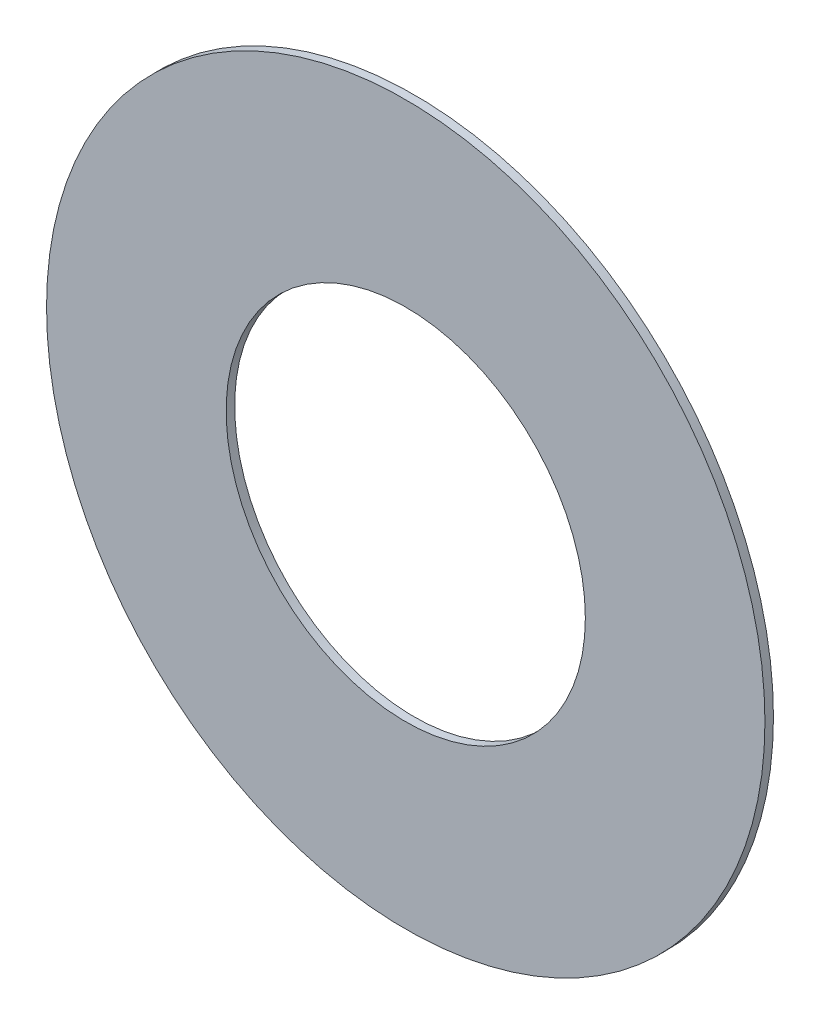
ISO-10303-21;
HEADER;
FILE_DESCRIPTION(('STEP AP214'),'2;1');
FILE_NAME('part.step','',(''),(''),'','','');
FILE_SCHEMA(('AUTOMOTIVE_DESIGN { 1 0 10303 214 1 1 1 1 }'));
ENDSEC;
DATA;
#1=APPLICATION_CONTEXT('core data for automotive mechanical design processes');
#2=APPLICATION_PROTOCOL_DEFINITION('international standard','automotive_design',2000,#1);
#3=PRODUCT_CONTEXT('',#1,'mechanical');
#4=PRODUCT('Part','Part','',(#3));
#5=PRODUCT_RELATED_PRODUCT_CATEGORY('part','',(#4));
#6=PRODUCT_DEFINITION_FORMATION('','',#4);
#7=PRODUCT_DEFINITION_CONTEXT('part definition',#1,'design');
#8=PRODUCT_DEFINITION('design','',#6,#7);
#9=PRODUCT_DEFINITION_SHAPE('','',#8);
#10=(LENGTH_UNIT() NAMED_UNIT(*) SI_UNIT(.MILLI.,.METRE.));
#11=(NAMED_UNIT(*) PLANE_ANGLE_UNIT() SI_UNIT($,.RADIAN.));
#12=(NAMED_UNIT(*) SI_UNIT($,.STERADIAN.) SOLID_ANGLE_UNIT());
#13=UNCERTAINTY_MEASURE_WITH_UNIT(LENGTH_MEASURE(1.E-05),#10,'distance_accuracy_value','');
#14=(GEOMETRIC_REPRESENTATION_CONTEXT(3) GLOBAL_UNCERTAINTY_ASSIGNED_CONTEXT((#13)) GLOBAL_UNIT_ASSIGNED_CONTEXT((#10,
#11,#12)) REPRESENTATION_CONTEXT('',''));
#15=CARTESIAN_POINT('',(0.,0.,0.));
#16=DIRECTION('',(0.,0.,1.));
#17=DIRECTION('',(1.,0.,0.));
#18=AXIS2_PLACEMENT_3D('',#15,#16,#17);
#19=CARTESIAN_POINT('',(0.,0.,0.));
#20=DIRECTION('',(0.,0.,-1.));
#21=DIRECTION('',(1.,0.,0.));
#22=AXIS2_PLACEMENT_3D('',#19,#20,#21);
#23=CYLINDRICAL_SURFACE('',#22,1.49999954);
#24=CARTESIAN_POINT('',(0.,0.,0.03556));
#25=DIRECTION('',(0.,0.,1.));
#26=DIRECTION('',(1.,0.,0.));
#27=AXIS2_PLACEMENT_3D('',#24,#25,#26);
#28=CIRCLE('',#27,1.49999954);
#29=CARTESIAN_POINT('',(1.49999954,0.,0.03556));
#30=VERTEX_POINT('',#29);
#31=EDGE_CURVE('E11',#30,#30,#28,.T.);
#32=ORIENTED_EDGE('',*,*,#31,.F.);
#33=DIRECTION('',(0.,0.,1.));
#34=VECTOR('',#33,1.);
#35=CARTESIAN_POINT('',(1.49999954,0.,0.));
#36=LINE('',#35,#34);
#37=CARTESIAN_POINT('',(1.49999954,0.,0.));
#38=VERTEX_POINT('',#37);
#39=EDGE_CURVE('E24',#38,#30,#36,.T.);
#40=ORIENTED_EDGE('',*,*,#39,.F.);
#41=CARTESIAN_POINT('',(0.,0.,0.));
#42=DIRECTION('',(0.,0.,1.));
#43=DIRECTION('',(1.,0.,0.));
#44=AXIS2_PLACEMENT_3D('',#41,#42,#43);
#45=CIRCLE('',#44,1.49999954);
#46=EDGE_CURVE('E46',#38,#38,#45,.T.);
#47=ORIENTED_EDGE('',*,*,#46,.T.);
#48=ORIENTED_EDGE('',*,*,#39,.T.);
#49=EDGE_LOOP('',(#32,#40,#47,#48));
#50=FACE_BOUND('',#49,.T.);
#51=ADVANCED_FACE('F17',(#50),#23,.T.);
#52=CARTESIAN_POINT('',(0.,0.,0.));
#53=DIRECTION('',(0.,0.,-1.));
#54=DIRECTION('',(1.,0.,0.));
#55=AXIS2_PLACEMENT_3D('',#52,#53,#54);
#56=CYLINDRICAL_SURFACE('',#55,0.7499985);
#57=DIRECTION('',(0.,0.,1.));
#58=VECTOR('',#57,1.);
#59=CARTESIAN_POINT('',(0.7499985,0.,0.));
#60=LINE('',#59,#58);
#61=CARTESIAN_POINT('',(0.7499985,0.,0.));
#62=VERTEX_POINT('',#61);
#63=CARTESIAN_POINT('',(0.7499985,0.,0.03556));
#64=VERTEX_POINT('',#63);
#65=EDGE_CURVE('E40',#62,#64,#60,.T.);
#66=ORIENTED_EDGE('',*,*,#65,.T.);
#67=CARTESIAN_POINT('',(0.,0.,0.03556));
#68=DIRECTION('',(0.,0.,1.));
#69=DIRECTION('',(1.,0.,0.));
#70=AXIS2_PLACEMENT_3D('',#67,#68,#69);
#71=CIRCLE('',#70,0.7499985);
#72=EDGE_CURVE('E45',#64,#64,#71,.T.);
#73=ORIENTED_EDGE('',*,*,#72,.T.);
#74=ORIENTED_EDGE('',*,*,#65,.F.);
#75=CARTESIAN_POINT('',(0.,0.,0.));
#76=DIRECTION('',(0.,0.,1.));
#77=DIRECTION('',(1.,0.,0.));
#78=AXIS2_PLACEMENT_3D('',#75,#76,#77);
#79=CIRCLE('',#78,0.7499985);
#80=EDGE_CURVE('E43',#62,#62,#79,.T.);
#81=ORIENTED_EDGE('',*,*,#80,.F.);
#82=EDGE_LOOP('',(#66,#73,#74,#81));
#83=FACE_BOUND('',#82,.T.);
#84=ADVANCED_FACE('F42',(#83),#56,.F.);
#85=CARTESIAN_POINT('',(1.49999954,0.,0.));
#86=DIRECTION('',(0.,0.,-1.));
#87=DIRECTION('',(-1.,0.,0.));
#88=AXIS2_PLACEMENT_3D('',#85,#86,#87);
#89=PLANE('',#88);
#90=ORIENTED_EDGE('',*,*,#46,.F.);
#91=EDGE_LOOP('',(#90));
#92=FACE_BOUND('',#91,.T.);
#93=ORIENTED_EDGE('',*,*,#80,.T.);
#94=EDGE_LOOP('',(#93));
#95=FACE_BOUND('',#94,.T.);
#96=ADVANCED_FACE('F49',(#92,#95),#89,.T.);
#97=CARTESIAN_POINT('',(1.49999954,0.,0.03556));
#98=DIRECTION('',(0.,0.,-1.));
#99=DIRECTION('',(-1.,0.,0.));
#100=AXIS2_PLACEMENT_3D('',#97,#98,#99);
#101=PLANE('',#100);
#102=ORIENTED_EDGE('',*,*,#31,.T.);
#103=EDGE_LOOP('',(#102));
#104=FACE_BOUND('',#103,.T.);
#105=ORIENTED_EDGE('',*,*,#72,.F.);
#106=EDGE_LOOP('',(#105));
#107=FACE_BOUND('',#106,.T.);
#108=ADVANCED_FACE('F56',(#104,#107),#101,.F.);
#109=CLOSED_SHELL('',(#51,#84,#96,#108));
#110=MANIFOLD_SOLID_BREP('B1',#109);
#111=ADVANCED_BREP_SHAPE_REPRESENTATION('',(#18,#110),#14);
#112=SHAPE_DEFINITION_REPRESENTATION(#9,#111);
ENDSEC;
END-ISO-10303-21;
